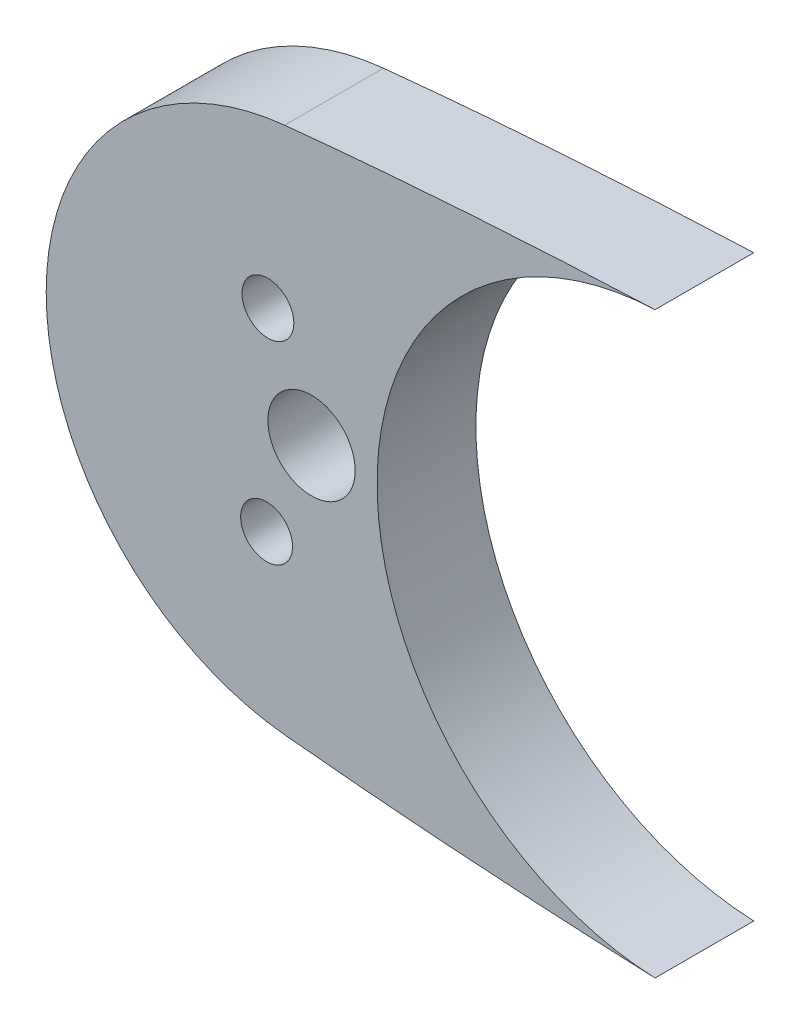
ISO-10303-21;
HEADER;
FILE_DESCRIPTION(('STEP AP214'),'2;1');
FILE_NAME('part.step','',(''),(''),'','','');
FILE_SCHEMA(('AUTOMOTIVE_DESIGN { 1 0 10303 214 1 1 1 1 }'));
ENDSEC;
DATA;
#1=APPLICATION_CONTEXT('core data for automotive mechanical design processes');
#2=APPLICATION_PROTOCOL_DEFINITION('international standard','automotive_design',2000,#1);
#3=PRODUCT_CONTEXT('',#1,'mechanical');
#4=PRODUCT('Part','Part','',(#3));
#5=PRODUCT_RELATED_PRODUCT_CATEGORY('part','',(#4));
#6=PRODUCT_DEFINITION_FORMATION('','',#4);
#7=PRODUCT_DEFINITION_CONTEXT('part definition',#1,'design');
#8=PRODUCT_DEFINITION('design','',#6,#7);
#9=PRODUCT_DEFINITION_SHAPE('','',#8);
#10=(LENGTH_UNIT() NAMED_UNIT(*) SI_UNIT(.MILLI.,.METRE.));
#11=(NAMED_UNIT(*) PLANE_ANGLE_UNIT() SI_UNIT($,.RADIAN.));
#12=(NAMED_UNIT(*) SI_UNIT($,.STERADIAN.) SOLID_ANGLE_UNIT());
#13=UNCERTAINTY_MEASURE_WITH_UNIT(LENGTH_MEASURE(1.E-05),#10,'distance_accuracy_value','');
#14=(GEOMETRIC_REPRESENTATION_CONTEXT(3) GLOBAL_UNCERTAINTY_ASSIGNED_CONTEXT((#13)) GLOBAL_UNIT_ASSIGNED_CONTEXT((#10,
#11,#12)) REPRESENTATION_CONTEXT('',''));
#15=CARTESIAN_POINT('',(0.,0.,0.));
#16=DIRECTION('',(0.,0.,1.));
#17=DIRECTION('',(1.,0.,0.));
#18=AXIS2_PLACEMENT_3D('',#15,#16,#17);
#19=CARTESIAN_POINT('',(46.632238895324,0.,10.25));
#20=DIRECTION('',(0.,0.,-1.));
#21=DIRECTION('',(-1.,0.,0.));
#22=AXIS2_PLACEMENT_3D('',#19,#20,#21);
#23=CYLINDRICAL_SURFACE('',#22,16.1182550375673);
#24=CARTESIAN_POINT('',(46.632238895324,0.,4.25));
#25=DIRECTION('',(0.,0.,1.));
#26=DIRECTION('',(1.,0.,0.));
#27=AXIS2_PLACEMENT_3D('',#24,#25,#26);
#28=CIRCLE('',#27,16.1182550375673);
#29=CARTESIAN_POINT('',(45.,-16.0353965228383,4.25));
#30=VERTEX_POINT('',#29);
#31=CARTESIAN_POINT('',(45.,16.0353965228383,4.25));
#32=VERTEX_POINT('',#31);
#33=EDGE_CURVE('E135',#30,#32,#28,.F.);
#34=ORIENTED_EDGE('',*,*,#33,.F.);
#35=DIRECTION('',(0.,0.,-1.));
#36=VECTOR('',#35,1.);
#37=CARTESIAN_POINT('',(45.,-16.0353965228383,10.25));
#38=LINE('',#37,#36);
#39=CARTESIAN_POINT('',(45.,-16.0353965228383,10.25));
#40=VERTEX_POINT('',#39);
#41=EDGE_CURVE('E11',#40,#30,#38,.T.);
#42=ORIENTED_EDGE('',*,*,#41,.F.);
#43=CARTESIAN_POINT('',(46.632238895324,0.,10.25));
#44=DIRECTION('',(0.,0.,1.));
#45=DIRECTION('',(1.,0.,0.));
#46=AXIS2_PLACEMENT_3D('',#43,#44,#45);
#47=CIRCLE('',#46,16.1182550375673);
#48=CARTESIAN_POINT('',(45.,16.0353965228383,10.25));
#49=VERTEX_POINT('',#48);
#50=EDGE_CURVE('E95',#40,#49,#47,.F.);
#51=ORIENTED_EDGE('',*,*,#50,.T.);
#52=DIRECTION('',(0.,0.,-1.));
#53=VECTOR('',#52,1.);
#54=CARTESIAN_POINT('',(45.,16.0353965228383,10.25));
#55=LINE('',#54,#53);
#56=EDGE_CURVE('E83',#49,#32,#55,.T.);
#57=ORIENTED_EDGE('',*,*,#56,.T.);
#58=EDGE_LOOP('',(#34,#42,#51,#57));
#59=FACE_BOUND('',#58,.T.);
#60=ADVANCED_FACE('F42',(#59),#23,.T.);
#61=CARTESIAN_POINT('',(300.,0.378,10.25));
#62=CARTESIAN_POINT('',(299.845901447221,0.39961034336831,10.25));
#63=CARTESIAN_POINT('',(299.230346714046,0.48593399083917,10.25));
#64=CARTESIAN_POINT('',(297.848901683276,0.678531057447331,10.25));
#65=CARTESIAN_POINT('',(295.556029122455,0.996787499241564,10.25));
#66=CARTESIAN_POINT('',(292.365739581197,1.43343203295321,10.25));
#67=CARTESIAN_POINT('',(288.297856433401,1.98344889126347,10.25));
#68=CARTESIAN_POINT('',(283.377248038078,2.63572648359042,10.25));
#69=CARTESIAN_POINT('',(277.63430498472,3.38149178862329,10.25));
#70=CARTESIAN_POINT('',(271.104515413466,4.20901604095742,10.25));
#71=CARTESIAN_POINT('',(263.828064626846,5.10718872872647,10.25));
#72=CARTESIAN_POINT('',(255.849823781818,6.06276893212352,10.25));
#73=CARTESIAN_POINT('',(247.21903434379,7.06424307195608,10.25));
#74=CARTESIAN_POINT('',(237.988783489903,8.09787318806774,10.25));
#75=CARTESIAN_POINT('',(228.216029511608,9.15107036010328,10.25));
#76=CARTESIAN_POINT('',(217.961088379031,10.2107446574668,10.25));
#77=CARTESIAN_POINT('',(207.287161839572,11.2632209265187,10.25));
#78=CARTESIAN_POINT('',(196.260086850424,12.2937248064858,10.25));
#79=CARTESIAN_POINT('',(184.947773044503,13.2887281219597,10.25));
#80=CARTESIAN_POINT('',(173.420088229148,14.2315961384787,10.25));
#81=CARTESIAN_POINT('',(161.747864995533,15.1069553720124,10.25));
#82=CARTESIAN_POINT('',(150.00317252135,15.8985540753976,10.25));
#83=CARTESIAN_POINT('',(138.258374542497,16.5898406039741,10.25));
#84=CARTESIAN_POINT('',(126.585774705795,17.1633504747405,10.25));
#85=CARTESIAN_POINT('',(115.057462615139,17.6037905135667,10.25));
#86=CARTESIAN_POINT('',(103.744181572864,17.8967919128621,10.25));
#87=CARTESIAN_POINT('',(92.7158453472272,18.0280433746414,10.25));
#88=CARTESIAN_POINT('',(82.0402185013839,17.9871287273908,10.25));
#89=CARTESIAN_POINT('',(71.7831190583338,17.7661449762132,10.25));
#90=CARTESIAN_POINT('',(62.0076841473254,17.3594904245971,10.25));
#91=CARTESIAN_POINT('',(52.7740834437817,16.7661013276277,10.25));
#92=CARTESIAN_POINT('',(44.1390669938569,15.987763153894,10.25));
#93=CARTESIAN_POINT('',(36.1554749512941,15.0305547578774,10.25));
#94=CARTESIAN_POINT('',(28.8719698679608,13.9026205663682,10.25));
#95=CARTESIAN_POINT('',(22.3326880228315,12.6157408879695,10.25));
#96=CARTESIAN_POINT('',(16.5759570466198,11.1844668147641,10.25));
#97=CARTESIAN_POINT('',(11.6344891822112,9.62275505380201,10.25));
#98=CARTESIAN_POINT('',(7.53339032845527,7.94515078115887,10.25));
#99=CARTESIAN_POINT('',(4.28573900369485,6.16300377839948,10.25));
#100=CARTESIAN_POINT('',(1.8965325692393,4.27279663699588,10.25));
#101=CARTESIAN_POINT('',(0.366265286449645,2.2288009510305,10.25));
#102=CARTESIAN_POINT('',(-0.170692645797294,0.,10.25));
#103=CARTESIAN_POINT('',(0.366265286449666,-2.22880095103055,10.25));
#104=CARTESIAN_POINT('',(1.89653256923925,-4.27279663699582,10.25));
#105=CARTESIAN_POINT('',(4.28573900369493,-6.16300377839955,10.25));
#106=CARTESIAN_POINT('',(7.53339032845521,-7.94515078115883,10.25));
#107=CARTESIAN_POINT('',(11.6344891822112,-9.62275505380201,10.25));
#108=CARTESIAN_POINT('',(16.5759570466199,-11.1844668147641,10.25));
#109=CARTESIAN_POINT('',(22.3326880228314,-12.6157408879695,10.25));
#110=CARTESIAN_POINT('',(28.8719698679608,-13.9026205663682,10.25));
#111=CARTESIAN_POINT('',(36.155474951294,-15.0305547578773,10.25));
#112=CARTESIAN_POINT('',(44.1390669938569,-15.987763153894,10.25));
#113=CARTESIAN_POINT('',(52.7740834437817,-16.7661013276277,10.25));
#114=CARTESIAN_POINT('',(62.0076841473254,-17.3594904245971,10.25));
#115=CARTESIAN_POINT('',(71.7831190583338,-17.7661449762132,10.25));
#116=CARTESIAN_POINT('',(82.0402185013839,-17.9871287273908,10.25));
#117=CARTESIAN_POINT('',(92.7158453472273,-18.0280433746414,10.25));
#118=CARTESIAN_POINT('',(103.744181572864,-17.8967919128621,10.25));
#119=CARTESIAN_POINT('',(115.057462615139,-17.6037905135667,10.25));
#120=CARTESIAN_POINT('',(126.585774705795,-17.1633504747405,10.25));
#121=CARTESIAN_POINT('',(138.258374542497,-16.5898406039741,10.25));
#122=CARTESIAN_POINT('',(150.00317252135,-15.8985540753976,10.25));
#123=CARTESIAN_POINT('',(161.747864995533,-15.1069553720124,10.25));
#124=CARTESIAN_POINT('',(173.420088229148,-14.2315961384787,10.25));
#125=CARTESIAN_POINT('',(184.947773044503,-13.2887281219597,10.25));
#126=CARTESIAN_POINT('',(196.260086850424,-12.2937248064858,10.25));
#127=CARTESIAN_POINT('',(207.287161839572,-11.2632209265187,10.25));
#128=CARTESIAN_POINT('',(217.961088379031,-10.2107446574668,10.25));
#129=CARTESIAN_POINT('',(228.216029511608,-9.15107036010328,10.25));
#130=CARTESIAN_POINT('',(237.988783489903,-8.09787318806774,10.25));
#131=CARTESIAN_POINT('',(247.21903434379,-7.06424307195608,10.25));
#132=CARTESIAN_POINT('',(255.849823781818,-6.0627689321235,10.25));
#133=CARTESIAN_POINT('',(263.828064626846,-5.10718872872648,10.25));
#134=CARTESIAN_POINT('',(271.104515413466,-4.20901604095741,10.25));
#135=CARTESIAN_POINT('',(277.63430498472,-3.38149178862329,10.25));
#136=CARTESIAN_POINT('',(283.377248038078,-2.63572648359043,10.25));
#137=CARTESIAN_POINT('',(288.297856433401,-1.98344889126346,10.25));
#138=CARTESIAN_POINT('',(292.365739581198,-1.43343203295321,10.25));
#139=CARTESIAN_POINT('',(295.556029122455,-0.996787499241567,10.25));
#140=CARTESIAN_POINT('',(297.848901683276,-0.678531057447318,10.25));
#141=CARTESIAN_POINT('',(299.230346714046,-0.48593399083919,10.25));
#142=CARTESIAN_POINT('',(299.845901447221,-0.399610343368311,10.25));
#143=CARTESIAN_POINT('',(300.,-0.378,10.25));
#144=B_SPLINE_CURVE_WITH_KNOTS('',3,(#61,#62,#63,#64,#65,#66,#67,#68,#69,#70,#71,#72,#73,#74,
#75,#76,#77,#78,#79,#80,#81,#82,#83,#84,#85,#86,#87,#88,#89,#90,#91,#92,#93,#94,#95,#96,#97,#98,
#99,#100,#101,#102,#103,#104,#105,#106,#107,#108,#109,#110,#111,#112,#113,#114,#115,#116,#117,
#118,#119,#120,#121,#122,#123,#124,#125,#126,#127,#128,#129,#130,#131,#132,#133,#134,#135,#136,
#137,#138,#139,#140,#141,#142,#143),.UNSPECIFIED.,.F.,.F.,(4,1,1,1,1,1,1,1,1,1,1,1,1,1,1,1,1,1,
1,1,1,1,1,1,1,1,1,1,1,1,1,1,1,1,1,1,1,1,1,1,1,1,1,1,1,1,1,1,1,1,1,1,1,1,1,1,1,1,1,1,1,1,1,1,1,1,
1,1,1,1,1,1,1,1,1,1,1,1,1,1,4),(0.,0.000763156679271448,0.00304846929193477,0.00684068957953669,
0.0121161317605396,0.0188407924276644,0.0269727495182071,0.0364598537113803,0.0472429445210447,
0.0592535547279477,0.0724172643119224,0.0866510217067198,0.101866322474926,0.117968955401192,
0.134857918638583,0.152428309483259,0.170571841082248,0.189174521814913,0.208122338288737,
0.227296649324545,0.246580070424687,0.265853108019993,0.284996761496293,0.303895241632262,
0.322432580929281,0.340498658943124,0.357984483489282,0.37478811429809,0.390812303248415,
0.405965006366899,0.420162443159487,0.433328264782086,0.445393603392471,0.456301171479378,
0.466003880875037,0.474472000637231,0.481696232103684,0.487703697963338,0.492583405321472,
0.496543603187854,0.5,0.503456396812145,0.507416594678528,0.512296302036662,0.518303767896316,
0.525527999362769,0.533996119124963,0.543698828520622,0.554606396607529,0.566671735217914,
0.579837556840513,0.594034993633101,0.609187696751585,0.62521188570191,0.642015516510718,
0.659501341056876,0.677567419070719,0.696104758367738,0.715003238503707,0.734146891980006,
0.753419929575313,0.772703350675454,0.791877661711263,0.810825478185087,0.829428158917752,
0.847571690516741,0.865142081361417,0.882031044598807,0.898133677525074,0.91334897829328,
0.927582735688077,0.940746445272052,0.952757055478955,0.96354014628862,0.973027250481793,
0.981159207572336,0.98788386823946,0.993159310420463,0.996951530708065,0.999236843320729,1.),.UNSPECIFIED.);
#145=DIRECTION('',(0.,0.,-1.));
#146=VECTOR('',#145,1.);
#147=SURFACE_OF_LINEAR_EXTRUSION('',#144,#146);
#148=CARTESIAN_POINT('',(300.,0.378,4.25));
#149=CARTESIAN_POINT('',(299.845901447221,0.39961034336831,4.25));
#150=CARTESIAN_POINT('',(299.230346714046,0.48593399083917,4.25));
#151=CARTESIAN_POINT('',(297.848901683276,0.678531057447331,4.25));
#152=CARTESIAN_POINT('',(295.556029122455,0.996787499241564,4.25));
#153=CARTESIAN_POINT('',(292.365739581197,1.43343203295321,4.25));
#154=CARTESIAN_POINT('',(288.297856433401,1.98344889126347,4.25));
#155=CARTESIAN_POINT('',(283.377248038078,2.63572648359042,4.25));
#156=CARTESIAN_POINT('',(277.63430498472,3.38149178862329,4.25));
#157=CARTESIAN_POINT('',(271.104515413466,4.20901604095742,4.25));
#158=CARTESIAN_POINT('',(263.828064626846,5.10718872872647,4.25));
#159=CARTESIAN_POINT('',(255.849823781818,6.06276893212352,4.25));
#160=CARTESIAN_POINT('',(247.21903434379,7.06424307195608,4.25));
#161=CARTESIAN_POINT('',(237.988783489903,8.09787318806774,4.25));
#162=CARTESIAN_POINT('',(228.216029511608,9.15107036010328,4.25));
#163=CARTESIAN_POINT('',(217.961088379031,10.2107446574668,4.25));
#164=CARTESIAN_POINT('',(207.287161839572,11.2632209265187,4.25));
#165=CARTESIAN_POINT('',(196.260086850424,12.2937248064858,4.25));
#166=CARTESIAN_POINT('',(184.947773044503,13.2887281219597,4.25));
#167=CARTESIAN_POINT('',(173.420088229148,14.2315961384787,4.25));
#168=CARTESIAN_POINT('',(161.747864995533,15.1069553720124,4.25));
#169=CARTESIAN_POINT('',(150.00317252135,15.8985540753976,4.25));
#170=CARTESIAN_POINT('',(138.258374542497,16.5898406039741,4.25));
#171=CARTESIAN_POINT('',(126.585774705795,17.1633504747405,4.25));
#172=CARTESIAN_POINT('',(115.057462615139,17.6037905135667,4.25));
#173=CARTESIAN_POINT('',(103.744181572864,17.8967919128621,4.25));
#174=CARTESIAN_POINT('',(92.7158453472272,18.0280433746414,4.25));
#175=CARTESIAN_POINT('',(82.0402185013839,17.9871287273908,4.25));
#176=CARTESIAN_POINT('',(71.7831190583338,17.7661449762132,4.25));
#177=CARTESIAN_POINT('',(62.0076841473254,17.3594904245971,4.25));
#178=CARTESIAN_POINT('',(52.7740834437817,16.7661013276277,4.25));
#179=CARTESIAN_POINT('',(44.1390669938569,15.987763153894,4.25));
#180=CARTESIAN_POINT('',(36.1554749512941,15.0305547578774,4.25));
#181=CARTESIAN_POINT('',(28.8719698679608,13.9026205663682,4.25));
#182=CARTESIAN_POINT('',(22.3326880228315,12.6157408879695,4.25));
#183=CARTESIAN_POINT('',(16.5759570466198,11.1844668147641,4.25));
#184=CARTESIAN_POINT('',(11.6344891822112,9.62275505380201,4.25));
#185=CARTESIAN_POINT('',(7.53339032845527,7.94515078115887,4.25));
#186=CARTESIAN_POINT('',(4.28573900369485,6.16300377839948,4.25));
#187=CARTESIAN_POINT('',(1.8965325692393,4.27279663699588,4.25));
#188=CARTESIAN_POINT('',(0.366265286449645,2.2288009510305,4.25));
#189=CARTESIAN_POINT('',(-0.170692645797294,0.,4.25));
#190=CARTESIAN_POINT('',(0.366265286449666,-2.22880095103055,4.25));
#191=CARTESIAN_POINT('',(1.89653256923925,-4.27279663699582,4.25));
#192=CARTESIAN_POINT('',(4.28573900369493,-6.16300377839955,4.25));
#193=CARTESIAN_POINT('',(7.53339032845521,-7.94515078115883,4.25));
#194=CARTESIAN_POINT('',(11.6344891822112,-9.62275505380201,4.25));
#195=CARTESIAN_POINT('',(16.5759570466199,-11.1844668147641,4.25));
#196=CARTESIAN_POINT('',(22.3326880228314,-12.6157408879695,4.25));
#197=CARTESIAN_POINT('',(28.8719698679608,-13.9026205663682,4.25));
#198=CARTESIAN_POINT('',(36.155474951294,-15.0305547578773,4.25));
#199=CARTESIAN_POINT('',(44.1390669938569,-15.987763153894,4.25));
#200=CARTESIAN_POINT('',(52.7740834437817,-16.7661013276277,4.25));
#201=CARTESIAN_POINT('',(62.0076841473254,-17.3594904245971,4.25));
#202=CARTESIAN_POINT('',(71.7831190583338,-17.7661449762132,4.25));
#203=CARTESIAN_POINT('',(82.0402185013839,-17.9871287273908,4.25));
#204=CARTESIAN_POINT('',(92.7158453472273,-18.0280433746414,4.25));
#205=CARTESIAN_POINT('',(103.744181572864,-17.8967919128621,4.25));
#206=CARTESIAN_POINT('',(115.057462615139,-17.6037905135667,4.25));
#207=CARTESIAN_POINT('',(126.585774705795,-17.1633504747405,4.25));
#208=CARTESIAN_POINT('',(138.258374542497,-16.5898406039741,4.25));
#209=CARTESIAN_POINT('',(150.00317252135,-15.8985540753976,4.25));
#210=CARTESIAN_POINT('',(161.747864995533,-15.1069553720124,4.25));
#211=CARTESIAN_POINT('',(173.420088229148,-14.2315961384787,4.25));
#212=CARTESIAN_POINT('',(184.947773044503,-13.2887281219597,4.25));
#213=CARTESIAN_POINT('',(196.260086850424,-12.2937248064858,4.25));
#214=CARTESIAN_POINT('',(207.287161839572,-11.2632209265187,4.25));
#215=CARTESIAN_POINT('',(217.961088379031,-10.2107446574668,4.25));
#216=CARTESIAN_POINT('',(228.216029511608,-9.15107036010328,4.25));
#217=CARTESIAN_POINT('',(237.988783489903,-8.09787318806774,4.25));
#218=CARTESIAN_POINT('',(247.21903434379,-7.06424307195608,4.25));
#219=CARTESIAN_POINT('',(255.849823781818,-6.0627689321235,4.25));
#220=CARTESIAN_POINT('',(263.828064626846,-5.10718872872648,4.25));
#221=CARTESIAN_POINT('',(271.104515413466,-4.20901604095741,4.25));
#222=CARTESIAN_POINT('',(277.63430498472,-3.38149178862329,4.25));
#223=CARTESIAN_POINT('',(283.377248038078,-2.63572648359043,4.25));
#224=CARTESIAN_POINT('',(288.297856433401,-1.98344889126346,4.25));
#225=CARTESIAN_POINT('',(292.365739581198,-1.43343203295321,4.25));
#226=CARTESIAN_POINT('',(295.556029122455,-0.996787499241567,4.25));
#227=CARTESIAN_POINT('',(297.848901683276,-0.678531057447318,4.25));
#228=CARTESIAN_POINT('',(299.230346714046,-0.48593399083919,4.25));
#229=CARTESIAN_POINT('',(299.845901447221,-0.399610343368311,4.25));
#230=CARTESIAN_POINT('',(300.,-0.378,4.25));
#231=B_SPLINE_CURVE_WITH_KNOTS('',3,(#148,#149,#150,#151,#152,#153,#154,#155,#156,#157,#158,
#159,#160,#161,#162,#163,#164,#165,#166,#167,#168,#169,#170,#171,#172,#173,#174,#175,#176,#177,
#178,#179,#180,#181,#182,#183,#184,#185,#186,#187,#188,#189,#190,#191,#192,#193,#194,#195,#196,
#197,#198,#199,#200,#201,#202,#203,#204,#205,#206,#207,#208,#209,#210,#211,#212,#213,#214,#215,
#216,#217,#218,#219,#220,#221,#222,#223,#224,#225,#226,#227,#228,#229,#230),.UNSPECIFIED.,.F.,
.F.,(4,1,1,1,1,1,1,1,1,1,1,1,1,1,1,1,1,1,1,1,1,1,1,1,1,1,1,1,1,1,1,1,1,1,1,1,1,1,1,1,1,1,1,1,1,
1,1,1,1,1,1,1,1,1,1,1,1,1,1,1,1,1,1,1,1,1,1,1,1,1,1,1,1,1,1,1,1,1,1,1,4),(0.,
0.000763156679271448,0.00304846929193477,0.00684068957953669,0.0121161317605396,
0.0188407924276644,0.0269727495182071,0.0364598537113803,0.0472429445210447,0.0592535547279477,
0.0724172643119224,0.0866510217067198,0.101866322474926,0.117968955401192,0.134857918638583,
0.152428309483259,0.170571841082248,0.189174521814913,0.208122338288737,0.227296649324545,
0.246580070424687,0.265853108019993,0.284996761496293,0.303895241632262,0.322432580929281,
0.340498658943124,0.357984483489282,0.37478811429809,0.390812303248415,0.405965006366899,
0.420162443159487,0.433328264782086,0.445393603392471,0.456301171479378,0.466003880875037,
0.474472000637231,0.481696232103684,0.487703697963338,0.492583405321472,0.496543603187854,0.5,
0.503456396812145,0.507416594678528,0.512296302036662,0.518303767896316,0.525527999362769,
0.533996119124963,0.543698828520622,0.554606396607529,0.566671735217914,0.579837556840513,
0.594034993633101,0.609187696751585,0.62521188570191,0.642015516510718,0.659501341056876,
0.677567419070719,0.696104758367738,0.715003238503707,0.734146891980006,0.753419929575313,
0.772703350675454,0.791877661711263,0.810825478185087,0.829428158917752,0.847571690516741,
0.865142081361417,0.882031044598807,0.898133677525074,0.91334897829328,0.927582735688077,
0.940746445272052,0.952757055478955,0.96354014628862,0.973027250481793,0.981159207572336,
0.98788386823946,0.993159310420463,0.996951530708065,0.999236843320729,1.),.UNSPECIFIED.);
#232=CARTESIAN_POINT('',(67.5,-17.5789284761189,4.25));
#233=VERTEX_POINT('',#232);
#234=EDGE_CURVE('E100',#30,#233,#231,.T.);
#235=ORIENTED_EDGE('',*,*,#234,.T.);
#236=DIRECTION('',(0.,0.,-1.));
#237=VECTOR('',#236,1.);
#238=CARTESIAN_POINT('',(67.5,-17.5789284761189,10.25));
#239=LINE('',#238,#237);
#240=CARTESIAN_POINT('',(67.5,-17.5789284761189,10.25));
#241=VERTEX_POINT('',#240);
#242=EDGE_CURVE('E51',#241,#233,#239,.T.);
#243=ORIENTED_EDGE('',*,*,#242,.F.);
#244=EDGE_CURVE('E89',#40,#241,#144,.T.);
#245=ORIENTED_EDGE('',*,*,#244,.F.);
#246=ORIENTED_EDGE('',*,*,#41,.T.);
#247=EDGE_LOOP('',(#235,#243,#245,#246));
#248=FACE_BOUND('',#247,.T.);
#249=ADVANCED_FACE('F98',(#248),#147,.F.);
#250=CARTESIAN_POINT('',(68.2098517870718,0.,10.25));
#251=DIRECTION('',(0.,0.,-1.));
#252=DIRECTION('',(-1.,0.,0.));
#253=AXIS2_PLACEMENT_3D('',#250,#251,#252);
#254=CYLINDRICAL_SURFACE('',#253,17.5932548417885);
#255=CARTESIAN_POINT('',(68.2098517870718,0.,4.25));
#256=DIRECTION('',(0.,0.,1.));
#257=DIRECTION('',(1.,0.,0.));
#258=AXIS2_PLACEMENT_3D('',#255,#256,#257);
#259=CIRCLE('',#258,17.5932548417885);
#260=CARTESIAN_POINT('',(67.5,17.5789284761189,4.25));
#261=VERTEX_POINT('',#260);
#262=EDGE_CURVE('E76',#233,#261,#259,.F.);
#263=ORIENTED_EDGE('',*,*,#262,.T.);
#264=DIRECTION('',(0.,0.,-1.));
#265=VECTOR('',#264,1.);
#266=CARTESIAN_POINT('',(67.5,17.5789284761189,10.25));
#267=LINE('',#266,#265);
#268=CARTESIAN_POINT('',(67.5,17.5789284761189,10.25));
#269=VERTEX_POINT('',#268);
#270=EDGE_CURVE('E101',#269,#261,#267,.T.);
#271=ORIENTED_EDGE('',*,*,#270,.F.);
#272=CARTESIAN_POINT('',(68.2098517870718,0.,10.25));
#273=DIRECTION('',(0.,0.,1.));
#274=DIRECTION('',(1.,0.,0.));
#275=AXIS2_PLACEMENT_3D('',#272,#273,#274);
#276=CIRCLE('',#275,17.5932548417885);
#277=EDGE_CURVE('E94',#241,#269,#276,.F.);
#278=ORIENTED_EDGE('',*,*,#277,.F.);
#279=ORIENTED_EDGE('',*,*,#242,.T.);
#280=EDGE_LOOP('',(#263,#271,#278,#279));
#281=FACE_BOUND('',#280,.T.);
#282=ADVANCED_FACE('F103',(#281),#254,.F.);
#283=CARTESIAN_POINT('',(300.,0.378,10.25));
#284=CARTESIAN_POINT('',(299.845901447221,0.39961034336831,10.25));
#285=CARTESIAN_POINT('',(299.230346714046,0.48593399083917,10.25));
#286=CARTESIAN_POINT('',(297.848901683276,0.678531057447331,10.25));
#287=CARTESIAN_POINT('',(295.556029122455,0.996787499241564,10.25));
#288=CARTESIAN_POINT('',(292.365739581197,1.43343203295321,10.25));
#289=CARTESIAN_POINT('',(288.297856433401,1.98344889126347,10.25));
#290=CARTESIAN_POINT('',(283.377248038078,2.63572648359042,10.25));
#291=CARTESIAN_POINT('',(277.63430498472,3.38149178862329,10.25));
#292=CARTESIAN_POINT('',(271.104515413466,4.20901604095742,10.25));
#293=CARTESIAN_POINT('',(263.828064626846,5.10718872872647,10.25));
#294=CARTESIAN_POINT('',(255.849823781818,6.06276893212352,10.25));
#295=CARTESIAN_POINT('',(247.21903434379,7.06424307195608,10.25));
#296=CARTESIAN_POINT('',(237.988783489903,8.09787318806774,10.25));
#297=CARTESIAN_POINT('',(228.216029511608,9.15107036010328,10.25));
#298=CARTESIAN_POINT('',(217.961088379031,10.2107446574668,10.25));
#299=CARTESIAN_POINT('',(207.287161839572,11.2632209265187,10.25));
#300=CARTESIAN_POINT('',(196.260086850424,12.2937248064858,10.25));
#301=CARTESIAN_POINT('',(184.947773044503,13.2887281219597,10.25));
#302=CARTESIAN_POINT('',(173.420088229148,14.2315961384787,10.25));
#303=CARTESIAN_POINT('',(161.747864995533,15.1069553720124,10.25));
#304=CARTESIAN_POINT('',(150.00317252135,15.8985540753976,10.25));
#305=CARTESIAN_POINT('',(138.258374542497,16.5898406039741,10.25));
#306=CARTESIAN_POINT('',(126.585774705795,17.1633504747405,10.25));
#307=CARTESIAN_POINT('',(115.057462615139,17.6037905135667,10.25));
#308=CARTESIAN_POINT('',(103.744181572864,17.8967919128621,10.25));
#309=CARTESIAN_POINT('',(92.7158453472272,18.0280433746414,10.25));
#310=CARTESIAN_POINT('',(82.0402185013839,17.9871287273908,10.25));
#311=CARTESIAN_POINT('',(71.7831190583338,17.7661449762132,10.25));
#312=CARTESIAN_POINT('',(62.0076841473254,17.3594904245971,10.25));
#313=CARTESIAN_POINT('',(52.7740834437817,16.7661013276277,10.25));
#314=CARTESIAN_POINT('',(44.1390669938569,15.987763153894,10.25));
#315=CARTESIAN_POINT('',(36.1554749512941,15.0305547578774,10.25));
#316=CARTESIAN_POINT('',(28.8719698679608,13.9026205663682,10.25));
#317=CARTESIAN_POINT('',(22.3326880228315,12.6157408879695,10.25));
#318=CARTESIAN_POINT('',(16.5759570466198,11.1844668147641,10.25));
#319=CARTESIAN_POINT('',(11.6344891822112,9.62275505380201,10.25));
#320=CARTESIAN_POINT('',(7.53339032845527,7.94515078115887,10.25));
#321=CARTESIAN_POINT('',(4.28573900369485,6.16300377839948,10.25));
#322=CARTESIAN_POINT('',(1.8965325692393,4.27279663699588,10.25));
#323=CARTESIAN_POINT('',(0.366265286449645,2.2288009510305,10.25));
#324=CARTESIAN_POINT('',(-0.170692645797294,0.,10.25));
#325=CARTESIAN_POINT('',(0.366265286449666,-2.22880095103055,10.25));
#326=CARTESIAN_POINT('',(1.89653256923925,-4.27279663699582,10.25));
#327=CARTESIAN_POINT('',(4.28573900369493,-6.16300377839955,10.25));
#328=CARTESIAN_POINT('',(7.53339032845521,-7.94515078115883,10.25));
#329=CARTESIAN_POINT('',(11.6344891822112,-9.62275505380201,10.25));
#330=CARTESIAN_POINT('',(16.5759570466199,-11.1844668147641,10.25));
#331=CARTESIAN_POINT('',(22.3326880228314,-12.6157408879695,10.25));
#332=CARTESIAN_POINT('',(28.8719698679608,-13.9026205663682,10.25));
#333=CARTESIAN_POINT('',(36.155474951294,-15.0305547578773,10.25));
#334=CARTESIAN_POINT('',(44.1390669938569,-15.987763153894,10.25));
#335=CARTESIAN_POINT('',(52.7740834437817,-16.7661013276277,10.25));
#336=CARTESIAN_POINT('',(62.0076841473254,-17.3594904245971,10.25));
#337=CARTESIAN_POINT('',(71.7831190583338,-17.7661449762132,10.25));
#338=CARTESIAN_POINT('',(82.0402185013839,-17.9871287273908,10.25));
#339=CARTESIAN_POINT('',(92.7158453472273,-18.0280433746414,10.25));
#340=CARTESIAN_POINT('',(103.744181572864,-17.8967919128621,10.25));
#341=CARTESIAN_POINT('',(115.057462615139,-17.6037905135667,10.25));
#342=CARTESIAN_POINT('',(126.585774705795,-17.1633504747405,10.25));
#343=CARTESIAN_POINT('',(138.258374542497,-16.5898406039741,10.25));
#344=CARTESIAN_POINT('',(150.00317252135,-15.8985540753976,10.25));
#345=CARTESIAN_POINT('',(161.747864995533,-15.1069553720124,10.25));
#346=CARTESIAN_POINT('',(173.420088229148,-14.2315961384787,10.25));
#347=CARTESIAN_POINT('',(184.947773044503,-13.2887281219597,10.25));
#348=CARTESIAN_POINT('',(196.260086850424,-12.2937248064858,10.25));
#349=CARTESIAN_POINT('',(207.287161839572,-11.2632209265187,10.25));
#350=CARTESIAN_POINT('',(217.961088379031,-10.2107446574668,10.25));
#351=CARTESIAN_POINT('',(228.216029511608,-9.15107036010328,10.25));
#352=CARTESIAN_POINT('',(237.988783489903,-8.09787318806774,10.25));
#353=CARTESIAN_POINT('',(247.21903434379,-7.06424307195608,10.25));
#354=CARTESIAN_POINT('',(255.849823781818,-6.0627689321235,10.25));
#355=CARTESIAN_POINT('',(263.828064626846,-5.10718872872648,10.25));
#356=CARTESIAN_POINT('',(271.104515413466,-4.20901604095741,10.25));
#357=CARTESIAN_POINT('',(277.63430498472,-3.38149178862329,10.25));
#358=CARTESIAN_POINT('',(283.377248038078,-2.63572648359043,10.25));
#359=CARTESIAN_POINT('',(288.297856433401,-1.98344889126346,10.25));
#360=CARTESIAN_POINT('',(292.365739581198,-1.43343203295321,10.25));
#361=CARTESIAN_POINT('',(295.556029122455,-0.996787499241567,10.25));
#362=CARTESIAN_POINT('',(297.848901683276,-0.678531057447318,10.25));
#363=CARTESIAN_POINT('',(299.230346714046,-0.48593399083919,10.25));
#364=CARTESIAN_POINT('',(299.845901447221,-0.399610343368311,10.25));
#365=CARTESIAN_POINT('',(300.,-0.378,10.25));
#366=B_SPLINE_CURVE_WITH_KNOTS('',3,(#283,#284,#285,#286,#287,#288,#289,#290,#291,#292,#293,
#294,#295,#296,#297,#298,#299,#300,#301,#302,#303,#304,#305,#306,#307,#308,#309,#310,#311,#312,
#313,#314,#315,#316,#317,#318,#319,#320,#321,#322,#323,#324,#325,#326,#327,#328,#329,#330,#331,
#332,#333,#334,#335,#336,#337,#338,#339,#340,#341,#342,#343,#344,#345,#346,#347,#348,#349,#350,
#351,#352,#353,#354,#355,#356,#357,#358,#359,#360,#361,#362,#363,#364,#365),.UNSPECIFIED.,.F.,
.F.,(4,1,1,1,1,1,1,1,1,1,1,1,1,1,1,1,1,1,1,1,1,1,1,1,1,1,1,1,1,1,1,1,1,1,1,1,1,1,1,1,1,1,1,1,1,
1,1,1,1,1,1,1,1,1,1,1,1,1,1,1,1,1,1,1,1,1,1,1,1,1,1,1,1,1,1,1,1,1,1,1,4),(0.,
0.000763156679271448,0.00304846929193477,0.00684068957953669,0.0121161317605396,
0.0188407924276644,0.0269727495182071,0.0364598537113803,0.0472429445210447,0.0592535547279477,
0.0724172643119224,0.0866510217067198,0.101866322474926,0.117968955401192,0.134857918638583,
0.152428309483259,0.170571841082248,0.189174521814913,0.208122338288737,0.227296649324545,
0.246580070424687,0.265853108019993,0.284996761496293,0.303895241632262,0.322432580929281,
0.340498658943124,0.357984483489282,0.37478811429809,0.390812303248415,0.405965006366899,
0.420162443159487,0.433328264782086,0.445393603392471,0.456301171479378,0.466003880875037,
0.474472000637231,0.481696232103684,0.487703697963338,0.492583405321472,0.496543603187854,0.5,
0.503456396812145,0.507416594678528,0.512296302036662,0.518303767896316,0.525527999362769,
0.533996119124963,0.543698828520622,0.554606396607529,0.566671735217914,0.579837556840513,
0.594034993633101,0.609187696751585,0.62521188570191,0.642015516510718,0.659501341056876,
0.677567419070719,0.696104758367738,0.715003238503707,0.734146891980006,0.753419929575313,
0.772703350675454,0.791877661711263,0.810825478185087,0.829428158917752,0.847571690516741,
0.865142081361417,0.882031044598807,0.898133677525074,0.91334897829328,0.927582735688077,
0.940746445272052,0.952757055478955,0.96354014628862,0.973027250481793,0.981159207572336,
0.98788386823946,0.993159310420463,0.996951530708065,0.999236843320729,1.),.UNSPECIFIED.);
#367=DIRECTION('',(0.,0.,-1.));
#368=VECTOR('',#367,1.);
#369=SURFACE_OF_LINEAR_EXTRUSION('',#366,#368);
#370=CARTESIAN_POINT('',(300.,0.378,4.25));
#371=CARTESIAN_POINT('',(299.845901447221,0.39961034336831,4.25));
#372=CARTESIAN_POINT('',(299.230346714046,0.48593399083917,4.25));
#373=CARTESIAN_POINT('',(297.848901683276,0.678531057447331,4.25));
#374=CARTESIAN_POINT('',(295.556029122455,0.996787499241564,4.25));
#375=CARTESIAN_POINT('',(292.365739581197,1.43343203295321,4.25));
#376=CARTESIAN_POINT('',(288.297856433401,1.98344889126347,4.25));
#377=CARTESIAN_POINT('',(283.377248038078,2.63572648359042,4.25));
#378=CARTESIAN_POINT('',(277.63430498472,3.38149178862329,4.25));
#379=CARTESIAN_POINT('',(271.104515413466,4.20901604095742,4.25));
#380=CARTESIAN_POINT('',(263.828064626846,5.10718872872647,4.25));
#381=CARTESIAN_POINT('',(255.849823781818,6.06276893212352,4.25));
#382=CARTESIAN_POINT('',(247.21903434379,7.06424307195608,4.25));
#383=CARTESIAN_POINT('',(237.988783489903,8.09787318806774,4.25));
#384=CARTESIAN_POINT('',(228.216029511608,9.15107036010328,4.25));
#385=CARTESIAN_POINT('',(217.961088379031,10.2107446574668,4.25));
#386=CARTESIAN_POINT('',(207.287161839572,11.2632209265187,4.25));
#387=CARTESIAN_POINT('',(196.260086850424,12.2937248064858,4.25));
#388=CARTESIAN_POINT('',(184.947773044503,13.2887281219597,4.25));
#389=CARTESIAN_POINT('',(173.420088229148,14.2315961384787,4.25));
#390=CARTESIAN_POINT('',(161.747864995533,15.1069553720124,4.25));
#391=CARTESIAN_POINT('',(150.00317252135,15.8985540753976,4.25));
#392=CARTESIAN_POINT('',(138.258374542497,16.5898406039741,4.25));
#393=CARTESIAN_POINT('',(126.585774705795,17.1633504747405,4.25));
#394=CARTESIAN_POINT('',(115.057462615139,17.6037905135667,4.25));
#395=CARTESIAN_POINT('',(103.744181572864,17.8967919128621,4.25));
#396=CARTESIAN_POINT('',(92.7158453472272,18.0280433746414,4.25));
#397=CARTESIAN_POINT('',(82.0402185013839,17.9871287273908,4.25));
#398=CARTESIAN_POINT('',(71.7831190583338,17.7661449762132,4.25));
#399=CARTESIAN_POINT('',(62.0076841473254,17.3594904245971,4.25));
#400=CARTESIAN_POINT('',(52.7740834437817,16.7661013276277,4.25));
#401=CARTESIAN_POINT('',(44.1390669938569,15.987763153894,4.25));
#402=CARTESIAN_POINT('',(36.1554749512941,15.0305547578774,4.25));
#403=CARTESIAN_POINT('',(28.8719698679608,13.9026205663682,4.25));
#404=CARTESIAN_POINT('',(22.3326880228315,12.6157408879695,4.25));
#405=CARTESIAN_POINT('',(16.5759570466198,11.1844668147641,4.25));
#406=CARTESIAN_POINT('',(11.6344891822112,9.62275505380201,4.25));
#407=CARTESIAN_POINT('',(7.53339032845527,7.94515078115887,4.25));
#408=CARTESIAN_POINT('',(4.28573900369485,6.16300377839948,4.25));
#409=CARTESIAN_POINT('',(1.8965325692393,4.27279663699588,4.25));
#410=CARTESIAN_POINT('',(0.366265286449645,2.2288009510305,4.25));
#411=CARTESIAN_POINT('',(-0.170692645797294,0.,4.25));
#412=CARTESIAN_POINT('',(0.366265286449666,-2.22880095103055,4.25));
#413=CARTESIAN_POINT('',(1.89653256923925,-4.27279663699582,4.25));
#414=CARTESIAN_POINT('',(4.28573900369493,-6.16300377839955,4.25));
#415=CARTESIAN_POINT('',(7.53339032845521,-7.94515078115883,4.25));
#416=CARTESIAN_POINT('',(11.6344891822112,-9.62275505380201,4.25));
#417=CARTESIAN_POINT('',(16.5759570466199,-11.1844668147641,4.25));
#418=CARTESIAN_POINT('',(22.3326880228314,-12.6157408879695,4.25));
#419=CARTESIAN_POINT('',(28.8719698679608,-13.9026205663682,4.25));
#420=CARTESIAN_POINT('',(36.155474951294,-15.0305547578773,4.25));
#421=CARTESIAN_POINT('',(44.1390669938569,-15.987763153894,4.25));
#422=CARTESIAN_POINT('',(52.7740834437817,-16.7661013276277,4.25));
#423=CARTESIAN_POINT('',(62.0076841473254,-17.3594904245971,4.25));
#424=CARTESIAN_POINT('',(71.7831190583338,-17.7661449762132,4.25));
#425=CARTESIAN_POINT('',(82.0402185013839,-17.9871287273908,4.25));
#426=CARTESIAN_POINT('',(92.7158453472273,-18.0280433746414,4.25));
#427=CARTESIAN_POINT('',(103.744181572864,-17.8967919128621,4.25));
#428=CARTESIAN_POINT('',(115.057462615139,-17.6037905135667,4.25));
#429=CARTESIAN_POINT('',(126.585774705795,-17.1633504747405,4.25));
#430=CARTESIAN_POINT('',(138.258374542497,-16.5898406039741,4.25));
#431=CARTESIAN_POINT('',(150.00317252135,-15.8985540753976,4.25));
#432=CARTESIAN_POINT('',(161.747864995533,-15.1069553720124,4.25));
#433=CARTESIAN_POINT('',(173.420088229148,-14.2315961384787,4.25));
#434=CARTESIAN_POINT('',(184.947773044503,-13.2887281219597,4.25));
#435=CARTESIAN_POINT('',(196.260086850424,-12.2937248064858,4.25));
#436=CARTESIAN_POINT('',(207.287161839572,-11.2632209265187,4.25));
#437=CARTESIAN_POINT('',(217.961088379031,-10.2107446574668,4.25));
#438=CARTESIAN_POINT('',(228.216029511608,-9.15107036010328,4.25));
#439=CARTESIAN_POINT('',(237.988783489903,-8.09787318806774,4.25));
#440=CARTESIAN_POINT('',(247.21903434379,-7.06424307195608,4.25));
#441=CARTESIAN_POINT('',(255.849823781818,-6.0627689321235,4.25));
#442=CARTESIAN_POINT('',(263.828064626846,-5.10718872872648,4.25));
#443=CARTESIAN_POINT('',(271.104515413466,-4.20901604095741,4.25));
#444=CARTESIAN_POINT('',(277.63430498472,-3.38149178862329,4.25));
#445=CARTESIAN_POINT('',(283.377248038078,-2.63572648359043,4.25));
#446=CARTESIAN_POINT('',(288.297856433401,-1.98344889126346,4.25));
#447=CARTESIAN_POINT('',(292.365739581198,-1.43343203295321,4.25));
#448=CARTESIAN_POINT('',(295.556029122455,-0.996787499241567,4.25));
#449=CARTESIAN_POINT('',(297.848901683276,-0.678531057447318,4.25));
#450=CARTESIAN_POINT('',(299.230346714046,-0.48593399083919,4.25));
#451=CARTESIAN_POINT('',(299.845901447221,-0.399610343368311,4.25));
#452=CARTESIAN_POINT('',(300.,-0.378,4.25));
#453=B_SPLINE_CURVE_WITH_KNOTS('',3,(#370,#371,#372,#373,#374,#375,#376,#377,#378,#379,#380,
#381,#382,#383,#384,#385,#386,#387,#388,#389,#390,#391,#392,#393,#394,#395,#396,#397,#398,#399,
#400,#401,#402,#403,#404,#405,#406,#407,#408,#409,#410,#411,#412,#413,#414,#415,#416,#417,#418,
#419,#420,#421,#422,#423,#424,#425,#426,#427,#428,#429,#430,#431,#432,#433,#434,#435,#436,#437,
#438,#439,#440,#441,#442,#443,#444,#445,#446,#447,#448,#449,#450,#451,#452),.UNSPECIFIED.,.F.,
.F.,(4,1,1,1,1,1,1,1,1,1,1,1,1,1,1,1,1,1,1,1,1,1,1,1,1,1,1,1,1,1,1,1,1,1,1,1,1,1,1,1,1,1,1,1,1,
1,1,1,1,1,1,1,1,1,1,1,1,1,1,1,1,1,1,1,1,1,1,1,1,1,1,1,1,1,1,1,1,1,1,1,4),(0.,
0.000763156679271448,0.00304846929193477,0.00684068957953669,0.0121161317605396,
0.0188407924276644,0.0269727495182071,0.0364598537113803,0.0472429445210447,0.0592535547279477,
0.0724172643119224,0.0866510217067198,0.101866322474926,0.117968955401192,0.134857918638583,
0.152428309483259,0.170571841082248,0.189174521814913,0.208122338288737,0.227296649324545,
0.246580070424687,0.265853108019993,0.284996761496293,0.303895241632262,0.322432580929281,
0.340498658943124,0.357984483489282,0.37478811429809,0.390812303248415,0.405965006366899,
0.420162443159487,0.433328264782086,0.445393603392471,0.456301171479378,0.466003880875037,
0.474472000637231,0.481696232103684,0.487703697963338,0.492583405321472,0.496543603187854,0.5,
0.503456396812145,0.507416594678528,0.512296302036662,0.518303767896316,0.525527999362769,
0.533996119124963,0.543698828520622,0.554606396607529,0.566671735217914,0.579837556840513,
0.594034993633101,0.609187696751585,0.62521188570191,0.642015516510718,0.659501341056876,
0.677567419070719,0.696104758367738,0.715003238503707,0.734146891980006,0.753419929575313,
0.772703350675454,0.791877661711263,0.810825478185087,0.829428158917752,0.847571690516741,
0.865142081361417,0.882031044598807,0.898133677525074,0.91334897829328,0.927582735688077,
0.940746445272052,0.952757055478955,0.96354014628862,0.973027250481793,0.981159207572336,
0.98788386823946,0.993159310420463,0.996951530708065,0.999236843320729,1.),.UNSPECIFIED.);
#454=EDGE_CURVE('E148',#261,#32,#453,.T.);
#455=ORIENTED_EDGE('',*,*,#454,.T.);
#456=ORIENTED_EDGE('',*,*,#56,.F.);
#457=EDGE_CURVE('E60',#269,#49,#366,.T.);
#458=ORIENTED_EDGE('',*,*,#457,.F.);
#459=ORIENTED_EDGE('',*,*,#270,.T.);
#460=EDGE_LOOP('',(#455,#456,#458,#459));
#461=FACE_BOUND('',#460,.T.);
#462=ADVANCED_FACE('F120',(#461),#369,.F.);
#463=CARTESIAN_POINT('',(46.632238895324,0.,10.25));
#464=DIRECTION('',(0.,0.,-1.));
#465=DIRECTION('',(-1.,0.,0.));
#466=AXIS2_PLACEMENT_3D('',#463,#464,#465);
#467=CYLINDRICAL_SURFACE('',#466,2.65);
#468=CARTESIAN_POINT('',(46.632238895324,0.,10.25));
#469=DIRECTION('',(0.,0.,1.));
#470=DIRECTION('',(1.,0.,0.));
#471=AXIS2_PLACEMENT_3D('',#468,#469,#470);
#472=CIRCLE('',#471,2.65);
#473=CARTESIAN_POINT('',(49.282238895324,0.,10.25));
#474=VERTEX_POINT('',#473);
#475=EDGE_CURVE('E105',#474,#474,#472,.T.);
#476=ORIENTED_EDGE('',*,*,#475,.T.);
#477=EDGE_LOOP('',(#476));
#478=FACE_BOUND('',#477,.T.);
#479=CARTESIAN_POINT('',(46.632238895324,0.,4.25));
#480=DIRECTION('',(0.,0.,1.));
#481=DIRECTION('',(1.,0.,0.));
#482=AXIS2_PLACEMENT_3D('',#479,#480,#481);
#483=CIRCLE('',#482,2.65);
#484=CARTESIAN_POINT('',(49.282238895324,0.,4.25));
#485=VERTEX_POINT('',#484);
#486=EDGE_CURVE('E152',#485,#485,#483,.T.);
#487=ORIENTED_EDGE('',*,*,#486,.F.);
#488=EDGE_LOOP('',(#487));
#489=FACE_BOUND('',#488,.T.);
#490=ADVANCED_FACE('F124',(#478,#489),#467,.F.);
#491=CARTESIAN_POINT('',(0.,0.,10.25));
#492=DIRECTION('',(0.,0.,1.));
#493=DIRECTION('',(1.,0.,0.));
#494=AXIS2_PLACEMENT_3D('',#491,#492,#493);
#495=PLANE('',#494);
#496=CARTESIAN_POINT('',(43.982238895324,5.9,10.25));
#497=DIRECTION('',(0.,0.,1.));
#498=DIRECTION('',(1.,0.,0.));
#499=AXIS2_PLACEMENT_3D('',#496,#497,#498);
#500=CIRCLE('',#499,1.575);
#501=CARTESIAN_POINT('',(45.557238895324,5.9,10.25));
#502=VERTEX_POINT('',#501);
#503=EDGE_CURVE('E160',#502,#502,#500,.T.);
#504=ORIENTED_EDGE('',*,*,#503,.F.);
#505=EDGE_LOOP('',(#504));
#506=FACE_BOUND('',#505,.T.);
#507=CARTESIAN_POINT('',(43.9027442347513,-5.9,10.25));
#508=DIRECTION('',(0.,0.,1.));
#509=DIRECTION('',(1.,0.,0.));
#510=AXIS2_PLACEMENT_3D('',#507,#508,#509);
#511=CIRCLE('',#510,1.575);
#512=CARTESIAN_POINT('',(45.4777442347513,-5.9,10.25));
#513=VERTEX_POINT('',#512);
#514=EDGE_CURVE('E164',#513,#513,#511,.T.);
#515=ORIENTED_EDGE('',*,*,#514,.F.);
#516=EDGE_LOOP('',(#515));
#517=FACE_BOUND('',#516,.T.);
#518=ORIENTED_EDGE('',*,*,#50,.F.);
#519=ORIENTED_EDGE('',*,*,#244,.T.);
#520=ORIENTED_EDGE('',*,*,#277,.T.);
#521=ORIENTED_EDGE('',*,*,#457,.T.);
#522=EDGE_LOOP('',(#518,#519,#520,#521));
#523=FACE_BOUND('',#522,.T.);
#524=ORIENTED_EDGE('',*,*,#475,.F.);
#525=EDGE_LOOP('',(#524));
#526=FACE_BOUND('',#525,.T.);
#527=ADVANCED_FACE('F91',(#506,#517,#523,#526),#495,.T.);
#528=CARTESIAN_POINT('',(0.,0.,4.25));
#529=DIRECTION('',(0.,0.,1.));
#530=DIRECTION('',(1.,0.,0.));
#531=AXIS2_PLACEMENT_3D('',#528,#529,#530);
#532=PLANE('',#531);
#533=CARTESIAN_POINT('',(43.982238895324,5.9,4.25));
#534=DIRECTION('',(0.,0.,1.));
#535=DIRECTION('',(1.,0.,0.));
#536=AXIS2_PLACEMENT_3D('',#533,#534,#535);
#537=CIRCLE('',#536,1.575);
#538=CARTESIAN_POINT('',(45.557238895324,5.9,4.25));
#539=VERTEX_POINT('',#538);
#540=EDGE_CURVE('E45',#539,#539,#537,.T.);
#541=ORIENTED_EDGE('',*,*,#540,.T.);
#542=EDGE_LOOP('',(#541));
#543=FACE_BOUND('',#542,.T.);
#544=CARTESIAN_POINT('',(43.9027442347513,-5.9,4.25));
#545=DIRECTION('',(0.,0.,1.));
#546=DIRECTION('',(1.,0.,0.));
#547=AXIS2_PLACEMENT_3D('',#544,#545,#546);
#548=CIRCLE('',#547,1.575);
#549=CARTESIAN_POINT('',(45.4777442347513,-5.9,4.25));
#550=VERTEX_POINT('',#549);
#551=EDGE_CURVE('E140',#550,#550,#548,.T.);
#552=ORIENTED_EDGE('',*,*,#551,.T.);
#553=EDGE_LOOP('',(#552));
#554=FACE_BOUND('',#553,.T.);
#555=ORIENTED_EDGE('',*,*,#33,.T.);
#556=ORIENTED_EDGE('',*,*,#454,.F.);
#557=ORIENTED_EDGE('',*,*,#262,.F.);
#558=ORIENTED_EDGE('',*,*,#234,.F.);
#559=EDGE_LOOP('',(#555,#556,#557,#558));
#560=FACE_BOUND('',#559,.T.);
#561=ORIENTED_EDGE('',*,*,#486,.T.);
#562=EDGE_LOOP('',(#561));
#563=FACE_BOUND('',#562,.T.);
#564=ADVANCED_FACE('F176',(#543,#554,#560,#563),#532,.F.);
#565=CARTESIAN_POINT('',(43.9027442347513,-5.9,0.25));
#566=DIRECTION('',(0.,0.,1.));
#567=DIRECTION('',(1.,0.,0.));
#568=AXIS2_PLACEMENT_3D('',#565,#566,#567);
#569=CYLINDRICAL_SURFACE('',#568,1.575);
#570=ORIENTED_EDGE('',*,*,#514,.T.);
#571=EDGE_LOOP('',(#570));
#572=FACE_BOUND('',#571,.T.);
#573=ORIENTED_EDGE('',*,*,#551,.F.);
#574=EDGE_LOOP('',(#573));
#575=FACE_BOUND('',#574,.T.);
#576=ADVANCED_FACE('F172',(#572,#575),#569,.F.);
#577=CARTESIAN_POINT('',(43.982238895324,5.9,0.25));
#578=DIRECTION('',(0.,0.,1.));
#579=DIRECTION('',(1.,0.,0.));
#580=AXIS2_PLACEMENT_3D('',#577,#578,#579);
#581=CYLINDRICAL_SURFACE('',#580,1.575);
#582=ORIENTED_EDGE('',*,*,#503,.T.);
#583=EDGE_LOOP('',(#582));
#584=FACE_BOUND('',#583,.T.);
#585=ORIENTED_EDGE('',*,*,#540,.F.);
#586=EDGE_LOOP('',(#585));
#587=FACE_BOUND('',#586,.T.);
#588=ADVANCED_FACE('F189',(#584,#587),#581,.F.);
#589=CLOSED_SHELL('',(#60,#249,#282,#462,#490,#527,#564,#576,#588));
#590=MANIFOLD_SOLID_BREP('B2',#589);
#591=ADVANCED_BREP_SHAPE_REPRESENTATION('',(#18,#590),#14);
#592=SHAPE_DEFINITION_REPRESENTATION(#9,#591);
ENDSEC;
END-ISO-10303-21;
